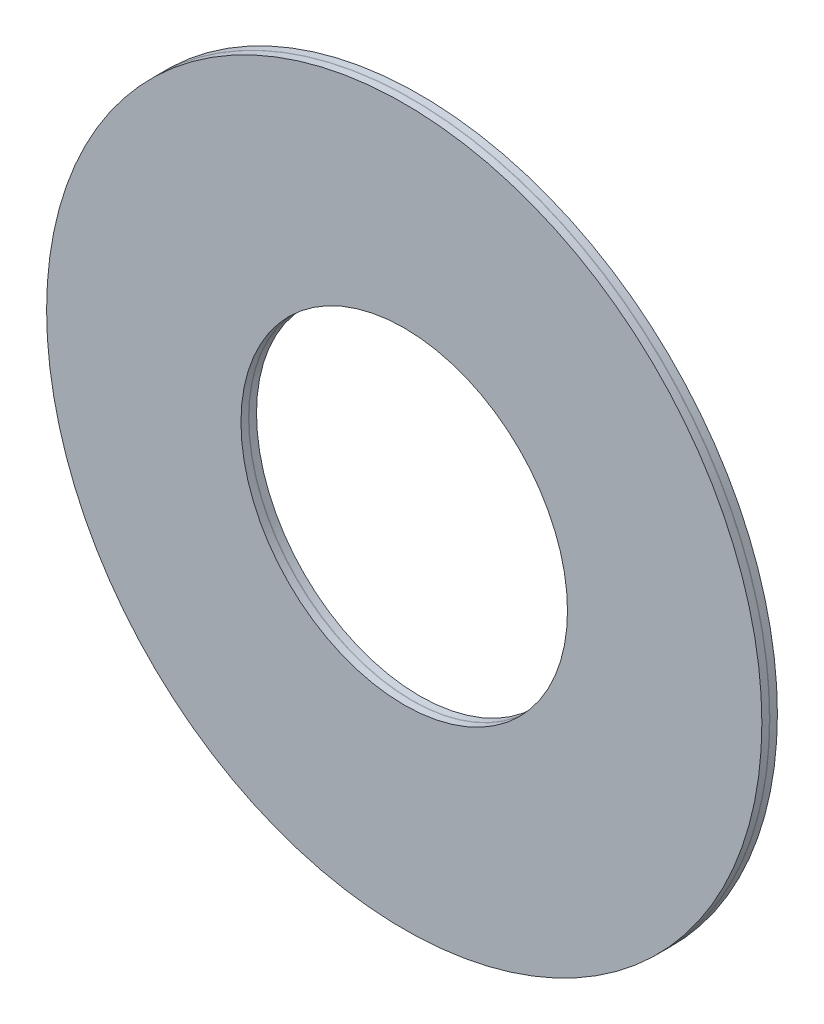
ISO-10303-21;
HEADER;
FILE_DESCRIPTION(('STEP AP214'),'2;1');
FILE_NAME('part.step','',(''),(''),'','','');
FILE_SCHEMA(('AUTOMOTIVE_DESIGN { 1 0 10303 214 1 1 1 1 }'));
ENDSEC;
DATA;
#1=APPLICATION_CONTEXT('core data for automotive mechanical design processes');
#2=APPLICATION_PROTOCOL_DEFINITION('international standard','automotive_design',2000,#1);
#3=PRODUCT_CONTEXT('',#1,'mechanical');
#4=PRODUCT('Part','Part','',(#3));
#5=PRODUCT_RELATED_PRODUCT_CATEGORY('part','',(#4));
#6=PRODUCT_DEFINITION_FORMATION('','',#4);
#7=PRODUCT_DEFINITION_CONTEXT('part definition',#1,'design');
#8=PRODUCT_DEFINITION('design','',#6,#7);
#9=PRODUCT_DEFINITION_SHAPE('','',#8);
#10=(LENGTH_UNIT() NAMED_UNIT(*) SI_UNIT(.MILLI.,.METRE.));
#11=(NAMED_UNIT(*) PLANE_ANGLE_UNIT() SI_UNIT($,.RADIAN.));
#12=(NAMED_UNIT(*) SI_UNIT($,.STERADIAN.) SOLID_ANGLE_UNIT());
#13=UNCERTAINTY_MEASURE_WITH_UNIT(LENGTH_MEASURE(1.E-05),#10,'distance_accuracy_value','');
#14=(GEOMETRIC_REPRESENTATION_CONTEXT(3) GLOBAL_UNCERTAINTY_ASSIGNED_CONTEXT((#13)) GLOBAL_UNIT_ASSIGNED_CONTEXT((#10,
#11,#12)) REPRESENTATION_CONTEXT('',''));
#15=CARTESIAN_POINT('',(0.,0.,0.));
#16=DIRECTION('',(0.,0.,1.));
#17=DIRECTION('',(1.,0.,0.));
#18=AXIS2_PLACEMENT_3D('',#15,#16,#17);
#19=CARTESIAN_POINT('',(0.,16.66875,-0.025400000000001));
#20=DIRECTION('',(0.,0.,1.));
#21=DIRECTION('',(1.,0.,0.));
#22=AXIS2_PLACEMENT_3D('',#19,#20,#21);
#23=PLANE('',#22);
#24=CARTESIAN_POINT('',(0.,0.,-0.0254000000000058));
#25=DIRECTION('',(0.,0.,-1.));
#26=DIRECTION('',(-1.,0.,0.));
#27=AXIS2_PLACEMENT_3D('',#24,#25,#26);
#28=CIRCLE('',#27,16.66875);
#29=CARTESIAN_POINT('',(-16.66875,0.,-0.0254000000000058));
#30=VERTEX_POINT('',#29);
#31=EDGE_CURVE('E58',#30,#30,#28,.T.);
#32=ORIENTED_EDGE('',*,*,#31,.T.);
#33=EDGE_LOOP('',(#32));
#34=FACE_BOUND('',#33,.T.);
#35=CARTESIAN_POINT('',(0.,0.,-0.0253999999999961));
#36=DIRECTION('',(0.,0.,-1.));
#37=DIRECTION('',(-1.,0.,0.));
#38=AXIS2_PLACEMENT_3D('',#35,#36,#37);
#39=CIRCLE('',#38,36.5125);
#40=CARTESIAN_POINT('',(-36.5125,0.,-0.0253999999999961));
#41=VERTEX_POINT('',#40);
#42=EDGE_CURVE('E11',#41,#41,#39,.T.);
#43=ORIENTED_EDGE('',*,*,#42,.F.);
#44=EDGE_LOOP('',(#43));
#45=FACE_BOUND('',#44,.T.);
#46=ADVANCED_FACE('F46',(#34,#45),#23,.T.);
#47=CARTESIAN_POINT('',(0.,0.,-0.793750000000004));
#48=DIRECTION('',(0.,0.,-1.));
#49=DIRECTION('',(-1.,0.,0.));
#50=AXIS2_PLACEMENT_3D('',#47,#48,#49);
#51=CYLINDRICAL_SURFACE('',#50,36.5125);
#52=ORIENTED_EDGE('',*,*,#42,.T.);
#53=EDGE_LOOP('',(#52));
#54=FACE_BOUND('',#53,.T.);
#55=CARTESIAN_POINT('',(0.,0.,-0.793750000000016));
#56=DIRECTION('',(0.,0.,-1.));
#57=DIRECTION('',(-1.,0.,0.));
#58=AXIS2_PLACEMENT_3D('',#55,#56,#57);
#59=CIRCLE('',#58,36.5125);
#60=CARTESIAN_POINT('',(-36.5125,0.,-0.793750000000016));
#61=VERTEX_POINT('',#60);
#62=EDGE_CURVE('E55',#61,#61,#59,.T.);
#63=ORIENTED_EDGE('',*,*,#62,.F.);
#64=EDGE_LOOP('',(#63));
#65=FACE_BOUND('',#64,.T.);
#66=ADVANCED_FACE('F77',(#54,#65),#51,.T.);
#67=CARTESIAN_POINT('',(0.,36.5125,-0.793750000000009));
#68=DIRECTION('',(0.,0.,-1.));
#69=DIRECTION('',(-1.,0.,0.));
#70=AXIS2_PLACEMENT_3D('',#67,#68,#69);
#71=PLANE('',#70);
#72=ORIENTED_EDGE('',*,*,#62,.T.);
#73=EDGE_LOOP('',(#72));
#74=FACE_BOUND('',#73,.T.);
#75=CARTESIAN_POINT('',(0.,0.,-0.793750000000001));
#76=DIRECTION('',(0.,0.,-1.));
#77=DIRECTION('',(-1.,0.,0.));
#78=AXIS2_PLACEMENT_3D('',#75,#76,#77);
#79=CIRCLE('',#78,16.66875);
#80=CARTESIAN_POINT('',(-16.66875,0.,-0.793750000000001));
#81=VERTEX_POINT('',#80);
#82=EDGE_CURVE('E57',#81,#81,#79,.T.);
#83=ORIENTED_EDGE('',*,*,#82,.F.);
#84=EDGE_LOOP('',(#83));
#85=FACE_BOUND('',#84,.T.);
#86=ADVANCED_FACE('F70',(#74,#85),#71,.T.);
#87=CARTESIAN_POINT('',(0.,0.,-0.793750000000004));
#88=DIRECTION('',(0.,0.,-1.));
#89=DIRECTION('',(-1.,0.,0.));
#90=AXIS2_PLACEMENT_3D('',#87,#88,#89);
#91=CYLINDRICAL_SURFACE('',#90,16.66875);
#92=ORIENTED_EDGE('',*,*,#82,.T.);
#93=EDGE_LOOP('',(#92));
#94=FACE_BOUND('',#93,.T.);
#95=ORIENTED_EDGE('',*,*,#31,.F.);
#96=EDGE_LOOP('',(#95));
#97=FACE_BOUND('',#96,.T.);
#98=ADVANCED_FACE('F69',(#94,#97),#91,.F.);
#99=CLOSED_SHELL('',(#46,#66,#86,#98));
#100=MANIFOLD_SOLID_BREP('B2',#99);
#101=CARTESIAN_POINT('',(0.,16.66875,0.0254000000000027));
#102=DIRECTION('',(0.,0.,-1.));
#103=DIRECTION('',(-1.,0.,0.));
#104=AXIS2_PLACEMENT_3D('',#101,#102,#103);
#105=PLANE('',#104);
#106=CARTESIAN_POINT('',(0.,0.,0.0254000000000039));
#107=DIRECTION('',(0.,0.,-1.));
#108=DIRECTION('',(-1.,0.,0.));
#109=AXIS2_PLACEMENT_3D('',#106,#107,#108);
#110=CIRCLE('',#109,36.5125);
#111=CARTESIAN_POINT('',(-36.5125,0.,0.0254000000000039));
#112=VERTEX_POINT('',#111);
#113=EDGE_CURVE('E44',#112,#112,#110,.T.);
#114=ORIENTED_EDGE('',*,*,#113,.T.);
#115=EDGE_LOOP('',(#114));
#116=FACE_BOUND('',#115,.T.);
#117=CARTESIAN_POINT('',(0.,0.,0.0254000000000015));
#118=DIRECTION('',(0.,0.,-1.));
#119=DIRECTION('',(-1.,0.,0.));
#120=AXIS2_PLACEMENT_3D('',#117,#118,#119);
#121=CIRCLE('',#120,16.66875);
#122=CARTESIAN_POINT('',(-16.66875,0.,0.0254000000000015));
#123=VERTEX_POINT('',#122);
#124=EDGE_CURVE('E122',#123,#123,#121,.T.);
#125=ORIENTED_EDGE('',*,*,#124,.F.);
#126=EDGE_LOOP('',(#125));
#127=FACE_BOUND('',#126,.T.);
#128=ADVANCED_FACE('F110',(#116,#127),#105,.T.);
#129=CARTESIAN_POINT('',(0.,0.,-0.793750000000004));
#130=DIRECTION('',(0.,0.,-1.));
#131=DIRECTION('',(-1.,0.,0.));
#132=AXIS2_PLACEMENT_3D('',#129,#130,#131);
#133=CYLINDRICAL_SURFACE('',#132,36.5125);
#134=CARTESIAN_POINT('',(0.,0.,0.793750000000016));
#135=DIRECTION('',(0.,0.,-1.));
#136=DIRECTION('',(-1.,0.,0.));
#137=AXIS2_PLACEMENT_3D('',#134,#135,#136);
#138=CIRCLE('',#137,36.5125);
#139=CARTESIAN_POINT('',(-36.5125,0.,0.793750000000016));
#140=VERTEX_POINT('',#139);
#141=EDGE_CURVE('E113',#140,#140,#138,.T.);
#142=ORIENTED_EDGE('',*,*,#141,.T.);
#143=EDGE_LOOP('',(#142));
#144=FACE_BOUND('',#143,.T.);
#145=ORIENTED_EDGE('',*,*,#113,.F.);
#146=EDGE_LOOP('',(#145));
#147=FACE_BOUND('',#146,.T.);
#148=ADVANCED_FACE('F131',(#144,#147),#133,.T.);
#149=CARTESIAN_POINT('',(0.,36.5125,0.793750000000009));
#150=DIRECTION('',(0.,0.,1.));
#151=DIRECTION('',(1.,0.,0.));
#152=AXIS2_PLACEMENT_3D('',#149,#150,#151);
#153=PLANE('',#152);
#154=CARTESIAN_POINT('',(0.,0.,0.793750000000001));
#155=DIRECTION('',(0.,0.,-1.));
#156=DIRECTION('',(-1.,0.,0.));
#157=AXIS2_PLACEMENT_3D('',#154,#155,#156);
#158=CIRCLE('',#157,16.66875);
#159=CARTESIAN_POINT('',(-16.66875,0.,0.793750000000001));
#160=VERTEX_POINT('',#159);
#161=EDGE_CURVE('E120',#160,#160,#158,.T.);
#162=ORIENTED_EDGE('',*,*,#161,.T.);
#163=EDGE_LOOP('',(#162));
#164=FACE_BOUND('',#163,.T.);
#165=ORIENTED_EDGE('',*,*,#141,.F.);
#166=EDGE_LOOP('',(#165));
#167=FACE_BOUND('',#166,.T.);
#168=ADVANCED_FACE('F135',(#164,#167),#153,.T.);
#169=CARTESIAN_POINT('',(0.,0.,-0.793750000000004));
#170=DIRECTION('',(0.,0.,-1.));
#171=DIRECTION('',(-1.,0.,0.));
#172=AXIS2_PLACEMENT_3D('',#169,#170,#171);
#173=CYLINDRICAL_SURFACE('',#172,16.66875);
#174=ORIENTED_EDGE('',*,*,#124,.T.);
#175=EDGE_LOOP('',(#174));
#176=FACE_BOUND('',#175,.T.);
#177=ORIENTED_EDGE('',*,*,#161,.F.);
#178=EDGE_LOOP('',(#177));
#179=FACE_BOUND('',#178,.T.);
#180=ADVANCED_FACE('F130',(#176,#179),#173,.F.);
#181=CLOSED_SHELL('',(#128,#148,#168,#180));
#182=MANIFOLD_SOLID_BREP('B6',#181);
#183=CARTESIAN_POINT('',(0.,16.66875,-0.025400000000001));
#184=DIRECTION('',(0.,0.,-1.));
#185=DIRECTION('',(-1.,0.,0.));
#186=AXIS2_PLACEMENT_3D('',#183,#184,#185);
#187=PLANE('',#186);
#188=CARTESIAN_POINT('',(0.,0.,-0.0253999999999961));
#189=DIRECTION('',(0.,0.,-1.));
#190=DIRECTION('',(-1.,0.,0.));
#191=AXIS2_PLACEMENT_3D('',#188,#189,#190);
#192=CIRCLE('',#191,36.5125);
#193=CARTESIAN_POINT('',(-36.5125,0.,-0.0253999999999961));
#194=VERTEX_POINT('',#193);
#195=EDGE_CURVE('E174',#194,#194,#192,.T.);
#196=ORIENTED_EDGE('',*,*,#195,.T.);
#197=EDGE_LOOP('',(#196));
#198=FACE_BOUND('',#197,.T.);
#199=CARTESIAN_POINT('',(0.,0.,-0.0254000000000058));
#200=DIRECTION('',(0.,0.,-1.));
#201=DIRECTION('',(-1.,0.,0.));
#202=AXIS2_PLACEMENT_3D('',#199,#200,#201);
#203=CIRCLE('',#202,16.66875);
#204=CARTESIAN_POINT('',(-16.66875,0.,-0.0254000000000058));
#205=VERTEX_POINT('',#204);
#206=EDGE_CURVE('E106',#205,#205,#203,.T.);
#207=ORIENTED_EDGE('',*,*,#206,.F.);
#208=EDGE_LOOP('',(#207));
#209=FACE_BOUND('',#208,.T.);
#210=ADVANCED_FACE('F163',(#198,#209),#187,.T.);
#211=CARTESIAN_POINT('',(0.,0.,-0.793750000000004));
#212=DIRECTION('',(0.,0.,-1.));
#213=DIRECTION('',(-1.,0.,0.));
#214=AXIS2_PLACEMENT_3D('',#211,#212,#213);
#215=CYLINDRICAL_SURFACE('',#214,16.66875);
#216=ORIENTED_EDGE('',*,*,#206,.T.);
#217=EDGE_LOOP('',(#216));
#218=FACE_BOUND('',#217,.T.);
#219=CARTESIAN_POINT('',(0.,0.,0.0254000000000015));
#220=DIRECTION('',(0.,0.,-1.));
#221=DIRECTION('',(-1.,0.,0.));
#222=AXIS2_PLACEMENT_3D('',#219,#220,#221);
#223=CIRCLE('',#222,16.66875);
#224=CARTESIAN_POINT('',(-16.66875,0.,0.0254000000000015));
#225=VERTEX_POINT('',#224);
#226=EDGE_CURVE('E170',#225,#225,#223,.T.);
#227=ORIENTED_EDGE('',*,*,#226,.F.);
#228=EDGE_LOOP('',(#227));
#229=FACE_BOUND('',#228,.T.);
#230=ADVANCED_FACE('F192',(#218,#229),#215,.F.);
#231=CARTESIAN_POINT('',(0.,36.5125,0.0254000000000027));
#232=DIRECTION('',(0.,0.,1.));
#233=DIRECTION('',(1.,0.,0.));
#234=AXIS2_PLACEMENT_3D('',#231,#232,#233);
#235=PLANE('',#234);
#236=ORIENTED_EDGE('',*,*,#226,.T.);
#237=EDGE_LOOP('',(#236));
#238=FACE_BOUND('',#237,.T.);
#239=CARTESIAN_POINT('',(0.,0.,0.0254000000000039));
#240=DIRECTION('',(0.,0.,-1.));
#241=DIRECTION('',(-1.,0.,0.));
#242=AXIS2_PLACEMENT_3D('',#239,#240,#241);
#243=CIRCLE('',#242,36.5125);
#244=CARTESIAN_POINT('',(-36.5125,0.,0.0254000000000039));
#245=VERTEX_POINT('',#244);
#246=EDGE_CURVE('E171',#245,#245,#243,.T.);
#247=ORIENTED_EDGE('',*,*,#246,.F.);
#248=EDGE_LOOP('',(#247));
#249=FACE_BOUND('',#248,.T.);
#250=ADVANCED_FACE('F184',(#238,#249),#235,.T.);
#251=CARTESIAN_POINT('',(0.,0.,-0.793750000000004));
#252=DIRECTION('',(0.,0.,-1.));
#253=DIRECTION('',(-1.,0.,0.));
#254=AXIS2_PLACEMENT_3D('',#251,#252,#253);
#255=CYLINDRICAL_SURFACE('',#254,36.5125);
#256=ORIENTED_EDGE('',*,*,#246,.T.);
#257=EDGE_LOOP('',(#256));
#258=FACE_BOUND('',#257,.T.);
#259=ORIENTED_EDGE('',*,*,#195,.F.);
#260=EDGE_LOOP('',(#259));
#261=FACE_BOUND('',#260,.T.);
#262=ADVANCED_FACE('F182',(#258,#261),#255,.T.);
#263=CLOSED_SHELL('',(#210,#230,#250,#262));
#264=MANIFOLD_SOLID_BREP('B37',#263);
#265=ADVANCED_BREP_SHAPE_REPRESENTATION('',(#18,#100,#182,#264),#14);
#266=SHAPE_DEFINITION_REPRESENTATION(#9,#265);
ENDSEC;
END-ISO-10303-21;
